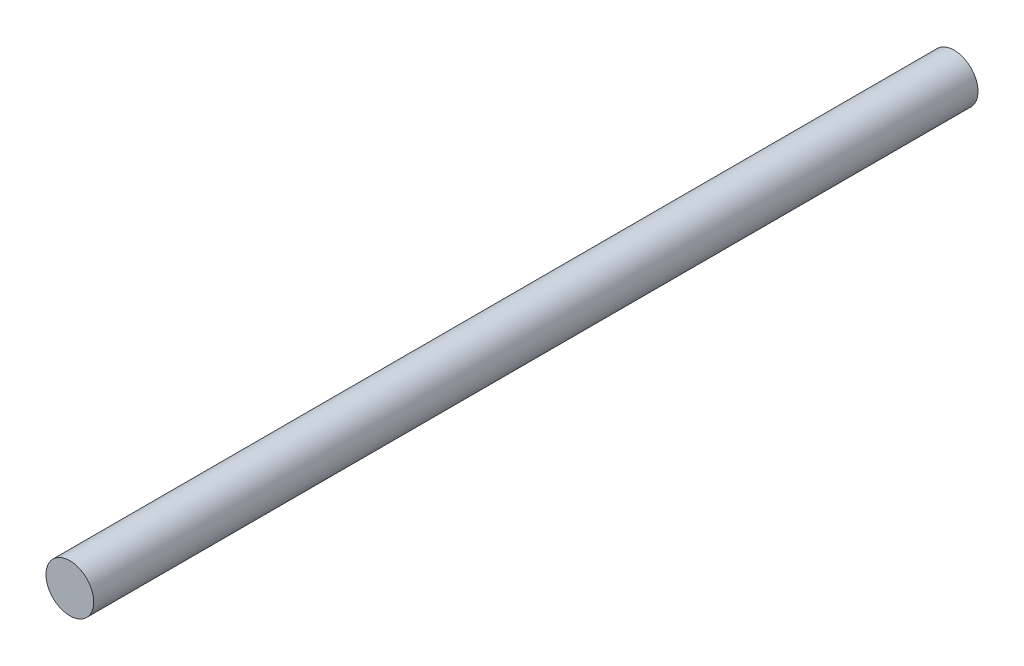
ISO-10303-21;
HEADER;
FILE_DESCRIPTION(('STEP AP214'),'2;1');
FILE_NAME('part.step','',(''),(''),'','','');
FILE_SCHEMA(('AUTOMOTIVE_DESIGN { 1 0 10303 214 1 1 1 1 }'));
ENDSEC;
DATA;
#1=APPLICATION_CONTEXT('core data for automotive mechanical design processes');
#2=APPLICATION_PROTOCOL_DEFINITION('international standard','automotive_design',2000,#1);
#3=PRODUCT_CONTEXT('',#1,'mechanical');
#4=PRODUCT('Part','Part','',(#3));
#5=PRODUCT_RELATED_PRODUCT_CATEGORY('part','',(#4));
#6=PRODUCT_DEFINITION_FORMATION('','',#4);
#7=PRODUCT_DEFINITION_CONTEXT('part definition',#1,'design');
#8=PRODUCT_DEFINITION('design','',#6,#7);
#9=PRODUCT_DEFINITION_SHAPE('','',#8);
#10=(LENGTH_UNIT() NAMED_UNIT(*) SI_UNIT(.MILLI.,.METRE.));
#11=(NAMED_UNIT(*) PLANE_ANGLE_UNIT() SI_UNIT($,.RADIAN.));
#12=(NAMED_UNIT(*) SI_UNIT($,.STERADIAN.) SOLID_ANGLE_UNIT());
#13=UNCERTAINTY_MEASURE_WITH_UNIT(LENGTH_MEASURE(1.E-05),#10,'distance_accuracy_value','');
#14=(GEOMETRIC_REPRESENTATION_CONTEXT(3) GLOBAL_UNCERTAINTY_ASSIGNED_CONTEXT((#13)) GLOBAL_UNIT_ASSIGNED_CONTEXT((#10,
#11,#12)) REPRESENTATION_CONTEXT('',''));
#15=CARTESIAN_POINT('',(0.,0.,0.));
#16=DIRECTION('',(0.,0.,1.));
#17=DIRECTION('',(1.,0.,0.));
#18=AXIS2_PLACEMENT_3D('',#15,#16,#17);
#19=CARTESIAN_POINT('',(0.,0.,-100.));
#20=DIRECTION('',(0.,0.,1.));
#21=DIRECTION('',(1.,0.,0.));
#22=AXIS2_PLACEMENT_3D('',#19,#20,#21);
#23=CYLINDRICAL_SURFACE('',#22,2.7);
#24=CARTESIAN_POINT('',(0.,0.,-100.));
#25=DIRECTION('',(0.,0.,1.));
#26=DIRECTION('',(1.,0.,0.));
#27=AXIS2_PLACEMENT_3D('',#24,#25,#26);
#28=CIRCLE('',#27,2.7);
#29=CARTESIAN_POINT('',(2.7,0.,-100.));
#30=VERTEX_POINT('',#29);
#31=EDGE_CURVE('E10',#30,#30,#28,.T.);
#32=ORIENTED_EDGE('',*,*,#31,.T.);
#33=EDGE_LOOP('',(#32));
#34=FACE_BOUND('',#33,.T.);
#35=CARTESIAN_POINT('',(0.,0.,0.));
#36=DIRECTION('',(0.,0.,1.));
#37=DIRECTION('',(1.,0.,0.));
#38=AXIS2_PLACEMENT_3D('',#35,#36,#37);
#39=CIRCLE('',#38,2.7);
#40=CARTESIAN_POINT('',(2.7,0.,0.));
#41=VERTEX_POINT('',#40);
#42=EDGE_CURVE('E39',#41,#41,#39,.T.);
#43=ORIENTED_EDGE('',*,*,#42,.F.);
#44=EDGE_LOOP('',(#43));
#45=FACE_BOUND('',#44,.T.);
#46=ADVANCED_FACE('F36',(#34,#45),#23,.T.);
#47=CARTESIAN_POINT('',(0.,0.,-100.));
#48=DIRECTION('',(0.,0.,1.));
#49=DIRECTION('',(1.,0.,0.));
#50=AXIS2_PLACEMENT_3D('',#47,#48,#49);
#51=PLANE('',#50);
#52=CARTESIAN_POINT('',(0.,0.,-100.));
#53=DIRECTION('',(0.,0.,1.));
#54=DIRECTION('',(1.,0.,0.));
#55=AXIS2_PLACEMENT_3D('',#52,#53,#54);
#56=CIRCLE('',#55,1.4);
#57=CARTESIAN_POINT('',(-1.4,0.,-100.));
#58=VERTEX_POINT('',#57);
#59=EDGE_CURVE('E51',#58,#58,#56,.T.);
#60=ORIENTED_EDGE('',*,*,#59,.T.);
#61=EDGE_LOOP('',(#60));
#62=FACE_BOUND('',#61,.T.);
#63=ORIENTED_EDGE('',*,*,#31,.F.);
#64=EDGE_LOOP('',(#63));
#65=FACE_BOUND('',#64,.T.);
#66=ADVANCED_FACE('F72',(#62,#65),#51,.F.);
#67=CARTESIAN_POINT('',(0.,0.,0.));
#68=DIRECTION('',(0.,0.,1.));
#69=DIRECTION('',(1.,0.,0.));
#70=AXIS2_PLACEMENT_3D('',#67,#68,#69);
#71=PLANE('',#70);
#72=ORIENTED_EDGE('',*,*,#42,.T.);
#73=EDGE_LOOP('',(#72));
#74=FACE_BOUND('',#73,.T.);
#75=ADVANCED_FACE('F69',(#74),#71,.T.);
#76=CARTESIAN_POINT('',(0.,0.,-93.5));
#77=DIRECTION('',(0.,0.,-1.));
#78=DIRECTION('',(-1.,0.,0.));
#79=AXIS2_PLACEMENT_3D('',#76,#77,#78);
#80=CYLINDRICAL_SURFACE('',#79,1.4);
#81=CARTESIAN_POINT('',(0.,0.,-93.5));
#82=DIRECTION('',(0.,0.,1.));
#83=DIRECTION('',(1.,0.,0.));
#84=AXIS2_PLACEMENT_3D('',#81,#82,#83);
#85=CIRCLE('',#84,1.4);
#86=CARTESIAN_POINT('',(-1.4,0.,-93.5));
#87=VERTEX_POINT('',#86);
#88=EDGE_CURVE('E49',#87,#87,#85,.T.);
#89=CARTESIAN_POINT('',(-1.4,0.,-93.5));
#90=CARTESIAN_POINT('',(-1.4,0.,-93.5677083333333));
#91=CARTESIAN_POINT('',(-1.4,0.,-93.6354166666667));
#92=CARTESIAN_POINT('',(-1.4,0.,-93.7708333333333));
#93=CARTESIAN_POINT('',(-1.4,0.,-93.8385416666667));
#94=CARTESIAN_POINT('',(-1.4,0.,-93.9739583333333));
#95=CARTESIAN_POINT('',(-1.4,0.,-94.0416666666667));
#96=CARTESIAN_POINT('',(-1.4,0.,-94.1770833333333));
#97=CARTESIAN_POINT('',(-1.4,0.,-94.2447916666667));
#98=CARTESIAN_POINT('',(-1.4,0.,-94.3802083333333));
#99=CARTESIAN_POINT('',(-1.4,0.,-94.4479166666667));
#100=CARTESIAN_POINT('',(-1.4,0.,-94.5833333333333));
#101=CARTESIAN_POINT('',(-1.4,0.,-94.6510416666667));
#102=CARTESIAN_POINT('',(-1.4,0.,-94.7864583333333));
#103=CARTESIAN_POINT('',(-1.4,0.,-94.8541666666667));
#104=CARTESIAN_POINT('',(-1.4,0.,-94.9895833333333));
#105=CARTESIAN_POINT('',(-1.4,0.,-95.0572916666667));
#106=CARTESIAN_POINT('',(-1.4,0.,-95.1927083333333));
#107=CARTESIAN_POINT('',(-1.4,0.,-95.2604166666667));
#108=CARTESIAN_POINT('',(-1.4,0.,-95.3958333333333));
#109=CARTESIAN_POINT('',(-1.4,0.,-95.4635416666667));
#110=CARTESIAN_POINT('',(-1.4,0.,-95.5989583333333));
#111=CARTESIAN_POINT('',(-1.4,0.,-95.6666666666667));
#112=CARTESIAN_POINT('',(-1.4,0.,-95.8020833333333));
#113=CARTESIAN_POINT('',(-1.4,0.,-95.8697916666667));
#114=CARTESIAN_POINT('',(-1.4,0.,-96.0052083333333));
#115=CARTESIAN_POINT('',(-1.4,0.,-96.0729166666667));
#116=CARTESIAN_POINT('',(-1.4,0.,-96.2083333333333));
#117=CARTESIAN_POINT('',(-1.4,0.,-96.2760416666667));
#118=CARTESIAN_POINT('',(-1.4,0.,-96.4114583333333));
#119=CARTESIAN_POINT('',(-1.4,0.,-96.4791666666667));
#120=CARTESIAN_POINT('',(-1.4,0.,-96.6145833333333));
#121=CARTESIAN_POINT('',(-1.4,0.,-96.6822916666667));
#122=CARTESIAN_POINT('',(-1.4,0.,-96.8177083333333));
#123=CARTESIAN_POINT('',(-1.4,0.,-96.8854166666667));
#124=CARTESIAN_POINT('',(-1.4,0.,-97.0208333333333));
#125=CARTESIAN_POINT('',(-1.4,0.,-97.0885416666667));
#126=CARTESIAN_POINT('',(-1.4,0.,-97.2239583333333));
#127=CARTESIAN_POINT('',(-1.4,0.,-97.2916666666667));
#128=CARTESIAN_POINT('',(-1.4,0.,-97.4270833333333));
#129=CARTESIAN_POINT('',(-1.4,0.,-97.4947916666667));
#130=CARTESIAN_POINT('',(-1.4,0.,-97.6302083333333));
#131=CARTESIAN_POINT('',(-1.4,0.,-97.6979166666667));
#132=CARTESIAN_POINT('',(-1.4,0.,-97.8333333333333));
#133=CARTESIAN_POINT('',(-1.4,0.,-97.9010416666667));
#134=CARTESIAN_POINT('',(-1.4,0.,-98.0364583333333));
#135=CARTESIAN_POINT('',(-1.4,0.,-98.1041666666667));
#136=CARTESIAN_POINT('',(-1.4,0.,-98.2395833333333));
#137=CARTESIAN_POINT('',(-1.4,0.,-98.3072916666667));
#138=CARTESIAN_POINT('',(-1.4,0.,-98.4427083333334));
#139=CARTESIAN_POINT('',(-1.4,0.,-98.5104166666667));
#140=CARTESIAN_POINT('',(-1.4,0.,-98.6458333333333));
#141=CARTESIAN_POINT('',(-1.4,0.,-98.7135416666667));
#142=CARTESIAN_POINT('',(-1.4,0.,-98.8489583333333));
#143=CARTESIAN_POINT('',(-1.4,0.,-98.9166666666667));
#144=CARTESIAN_POINT('',(-1.4,0.,-99.0520833333333));
#145=CARTESIAN_POINT('',(-1.4,0.,-99.1197916666667));
#146=CARTESIAN_POINT('',(-1.4,0.,-99.2552083333333));
#147=CARTESIAN_POINT('',(-1.4,0.,-99.3229166666667));
#148=CARTESIAN_POINT('',(-1.4,0.,-99.4583333333333));
#149=CARTESIAN_POINT('',(-1.4,0.,-99.5260416666667));
#150=CARTESIAN_POINT('',(-1.4,0.,-99.6614583333333));
#151=CARTESIAN_POINT('',(-1.4,0.,-99.7291666666667));
#152=CARTESIAN_POINT('',(-1.4,0.,-99.8645833333333));
#153=CARTESIAN_POINT('',(-1.4,0.,-99.9322916666667));
#154=CARTESIAN_POINT('',(-1.4,0.,-100.));
#155=B_SPLINE_CURVE_WITH_KNOTS('',3,(#89,#90,#91,#92,#93,#94,#95,#96,#97,#98,#99,#100,#101,#102,
#103,#104,#105,#106,#107,#108,#109,#110,#111,#112,#113,#114,#115,#116,#117,#118,#119,#120,#121,
#122,#123,#124,#125,#126,#127,#128,#129,#130,#131,#132,#133,#134,#135,#136,#137,#138,#139,#140,
#141,#142,#143,#144,#145,#146,#147,#148,#149,#150,#151,#152,#153,#154),.UNSPECIFIED.,.F.,.F.,(4,
2,2,2,2,2,2,2,2,2,2,2,2,2,2,2,2,2,2,2,2,2,2,2,2,2,2,2,2,2,2,2,4),(0.,0.203124999999998,
0.406249999999997,0.609374999999995,0.812499999999994,1.01562499999999,1.21874999999999,
1.42187499999999,1.625,1.828125,2.03125,2.234375,2.4375,2.64062499999999,2.84374999999999,
3.04687499999999,3.25,3.453125,3.65625,3.859375,4.0625,4.26562499999999,4.46874999999999,
4.67187499999999,4.875,5.078125,5.28125,5.484375,5.6875,5.890625,6.09374999999999,
6.29687499999999,6.50000000000001),.UNSPECIFIED.);
#156=EDGE_CURVE('BSEAM60',#87,#58,#155,.T.);
#157=ORIENTED_EDGE('',*,*,#88,.T.);
#158=ORIENTED_EDGE('',*,*,#59,.F.);
#159=ORIENTED_EDGE('',*,*,#156,.T.);
#160=ORIENTED_EDGE('',*,*,#156,.F.);
#161=EDGE_LOOP('',(#157,#159,#158,#160));
#162=FACE_BOUND('',#161,.T.);
#163=ADVANCED_FACE('F60',(#162),#80,.F.);
#164=CARTESIAN_POINT('',(0.,0.,-93.5));
#165=DIRECTION('',(0.,0.,1.));
#166=DIRECTION('',(1.,0.,0.));
#167=AXIS2_PLACEMENT_3D('',#164,#165,#166);
#168=PLANE('',#167);
#169=ORIENTED_EDGE('',*,*,#88,.F.);
#170=EDGE_LOOP('',(#169));
#171=FACE_BOUND('',#170,.T.);
#172=ADVANCED_FACE('F63',(#171),#168,.F.);
#173=CLOSED_SHELL('',(#46,#66,#75,#163,#172));
#174=MANIFOLD_SOLID_BREP('B2',#173);
#175=ADVANCED_BREP_SHAPE_REPRESENTATION('',(#18,#174),#14);
#176=SHAPE_DEFINITION_REPRESENTATION(#9,#175);
ENDSEC;
END-ISO-10303-21;
